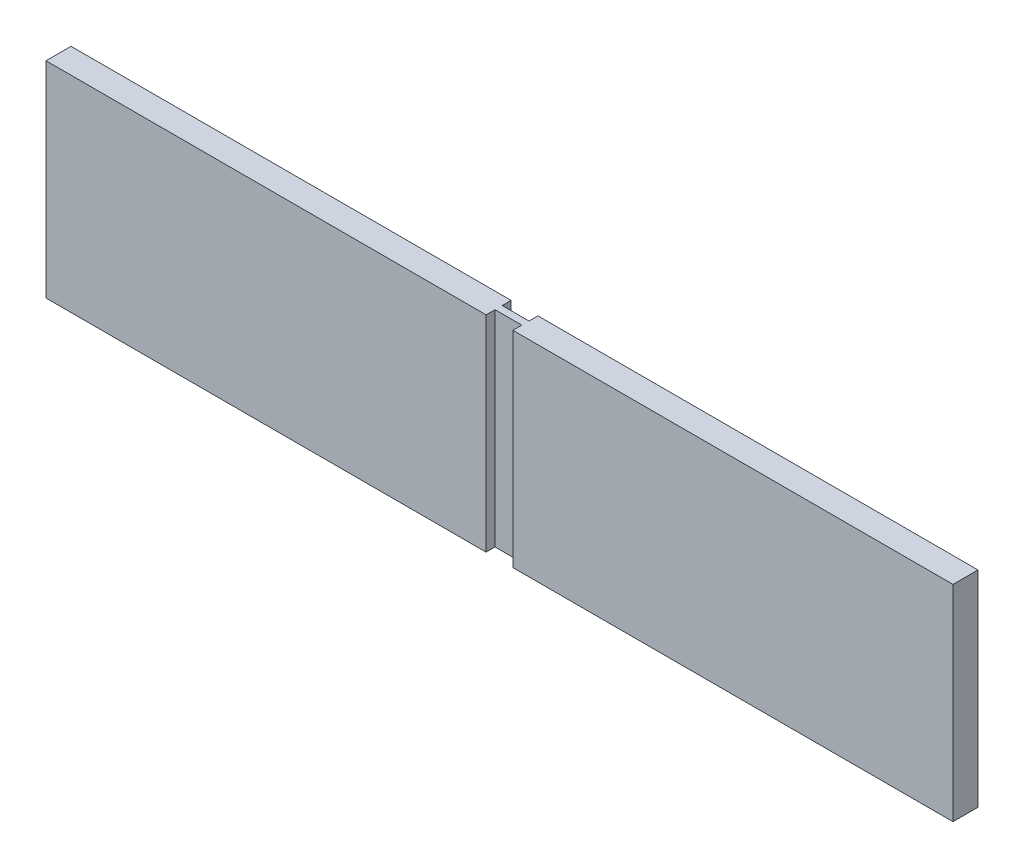
ISO-10303-21;
HEADER;
FILE_DESCRIPTION(('STEP AP214'),'2;1');
FILE_NAME('part.step','',(''),(''),'','','');
FILE_SCHEMA(('AUTOMOTIVE_DESIGN { 1 0 10303 214 1 1 1 1 }'));
ENDSEC;
DATA;
#1=APPLICATION_CONTEXT('core data for automotive mechanical design processes');
#2=APPLICATION_PROTOCOL_DEFINITION('international standard','automotive_design',2000,#1);
#3=PRODUCT_CONTEXT('',#1,'mechanical');
#4=PRODUCT('Part','Part','',(#3));
#5=PRODUCT_RELATED_PRODUCT_CATEGORY('part','',(#4));
#6=PRODUCT_DEFINITION_FORMATION('','',#4);
#7=PRODUCT_DEFINITION_CONTEXT('part definition',#1,'design');
#8=PRODUCT_DEFINITION('design','',#6,#7);
#9=PRODUCT_DEFINITION_SHAPE('','',#8);
#10=(LENGTH_UNIT() NAMED_UNIT(*) SI_UNIT(.MILLI.,.METRE.));
#11=(NAMED_UNIT(*) PLANE_ANGLE_UNIT() SI_UNIT($,.RADIAN.));
#12=(NAMED_UNIT(*) SI_UNIT($,.STERADIAN.) SOLID_ANGLE_UNIT());
#13=UNCERTAINTY_MEASURE_WITH_UNIT(LENGTH_MEASURE(1.E-05),#10,'distance_accuracy_value','');
#14=(GEOMETRIC_REPRESENTATION_CONTEXT(3) GLOBAL_UNCERTAINTY_ASSIGNED_CONTEXT((#13)) GLOBAL_UNIT_ASSIGNED_CONTEXT((#10,
#11,#12)) REPRESENTATION_CONTEXT('',''));
#15=CARTESIAN_POINT('',(0.,0.,0.));
#16=DIRECTION('',(0.,0.,1.));
#17=DIRECTION('',(1.,0.,0.));
#18=AXIS2_PLACEMENT_3D('',#15,#16,#17);
#19=CARTESIAN_POINT('',(0.,0.,2.8));
#20=DIRECTION('',(0.,0.,-1.));
#21=DIRECTION('',(-1.,0.,0.));
#22=AXIS2_PLACEMENT_3D('',#19,#20,#21);
#23=PLANE('',#22);
#24=DIRECTION('',(1.,0.,0.));
#25=VECTOR('',#24,1.);
#26=CARTESIAN_POINT('',(0.,0.,2.8));
#27=LINE('',#26,#25);
#28=CARTESIAN_POINT('',(0.,0.,2.8));
#29=VERTEX_POINT('',#28);
#30=CARTESIAN_POINT('',(49.25,0.,2.8));
#31=VERTEX_POINT('',#30);
#32=EDGE_CURVE('E137',#29,#31,#27,.T.);
#33=ORIENTED_EDGE('',*,*,#32,.T.);
#34=DIRECTION('',(0.,1.,0.));
#35=VECTOR('',#34,1.);
#36=CARTESIAN_POINT('',(49.25,0.,2.8));
#37=LINE('',#36,#35);
#38=CARTESIAN_POINT('',(49.25,23.,2.8));
#39=VERTEX_POINT('',#38);
#40=EDGE_CURVE('E11',#31,#39,#37,.T.);
#41=ORIENTED_EDGE('',*,*,#40,.T.);
#42=DIRECTION('',(-1.,0.,0.));
#43=VECTOR('',#42,1.);
#44=CARTESIAN_POINT('',(0.,23.,2.8));
#45=LINE('',#44,#43);
#46=CARTESIAN_POINT('',(0.,23.,2.8));
#47=VERTEX_POINT('',#46);
#48=EDGE_CURVE('E135',#39,#47,#45,.T.);
#49=ORIENTED_EDGE('',*,*,#48,.T.);
#50=DIRECTION('',(0.,-1.,0.));
#51=VECTOR('',#50,1.);
#52=CARTESIAN_POINT('',(0.,0.,2.8));
#53=LINE('',#52,#51);
#54=EDGE_CURVE('E163',#47,#29,#53,.T.);
#55=ORIENTED_EDGE('',*,*,#54,.T.);
#56=EDGE_LOOP('',(#33,#41,#49,#55));
#57=FACE_BOUND('',#56,.T.);
#58=ADVANCED_FACE('F32',(#57),#23,.F.);
#59=CARTESIAN_POINT('',(0.,0.,0.));
#60=DIRECTION('',(0.,0.,-1.));
#61=DIRECTION('',(-1.,0.,0.));
#62=AXIS2_PLACEMENT_3D('',#59,#60,#61);
#63=PLANE('',#62);
#64=DIRECTION('',(0.,1.,0.));
#65=VECTOR('',#64,1.);
#66=CARTESIAN_POINT('',(49.25,0.,0.));
#67=LINE('',#66,#65);
#68=CARTESIAN_POINT('',(49.25,0.,0.));
#69=VERTEX_POINT('',#68);
#70=CARTESIAN_POINT('',(49.25,23.,0.));
#71=VERTEX_POINT('',#70);
#72=EDGE_CURVE('E176',#69,#71,#67,.T.);
#73=ORIENTED_EDGE('',*,*,#72,.F.);
#74=DIRECTION('',(1.,0.,0.));
#75=VECTOR('',#74,1.);
#76=CARTESIAN_POINT('',(0.,0.,0.));
#77=LINE('',#76,#75);
#78=CARTESIAN_POINT('',(0.,0.,0.));
#79=VERTEX_POINT('',#78);
#80=EDGE_CURVE('E154',#79,#69,#77,.T.);
#81=ORIENTED_EDGE('',*,*,#80,.F.);
#82=DIRECTION('',(0.,-1.,0.));
#83=VECTOR('',#82,1.);
#84=CARTESIAN_POINT('',(0.,0.,0.));
#85=LINE('',#84,#83);
#86=CARTESIAN_POINT('',(0.,23.,0.));
#87=VERTEX_POINT('',#86);
#88=EDGE_CURVE('E149',#87,#79,#85,.T.);
#89=ORIENTED_EDGE('',*,*,#88,.F.);
#90=DIRECTION('',(-1.,0.,0.));
#91=VECTOR('',#90,1.);
#92=CARTESIAN_POINT('',(0.,23.,0.));
#93=LINE('',#92,#91);
#94=EDGE_CURVE('E159',#71,#87,#93,.T.);
#95=ORIENTED_EDGE('',*,*,#94,.F.);
#96=EDGE_LOOP('',(#73,#81,#89,#95));
#97=FACE_BOUND('',#96,.T.);
#98=ADVANCED_FACE('F229',(#97),#63,.T.);
#99=CARTESIAN_POINT('',(0.,0.,2.8));
#100=DIRECTION('',(1.,0.,0.));
#101=DIRECTION('',(0.,0.,-1.));
#102=AXIS2_PLACEMENT_3D('',#99,#100,#101);
#103=PLANE('',#102);
#104=ORIENTED_EDGE('',*,*,#88,.T.);
#105=DIRECTION('',(0.,0.,-1.));
#106=VECTOR('',#105,1.);
#107=CARTESIAN_POINT('',(0.,0.,2.8));
#108=LINE('',#107,#106);
#109=EDGE_CURVE('E171',#29,#79,#108,.T.);
#110=ORIENTED_EDGE('',*,*,#109,.F.);
#111=ORIENTED_EDGE('',*,*,#54,.F.);
#112=DIRECTION('',(0.,0.,-1.));
#113=VECTOR('',#112,1.);
#114=CARTESIAN_POINT('',(0.,23.,2.8));
#115=LINE('',#114,#113);
#116=EDGE_CURVE('E140',#47,#87,#115,.T.);
#117=ORIENTED_EDGE('',*,*,#116,.T.);
#118=EDGE_LOOP('',(#104,#110,#111,#117));
#119=FACE_BOUND('',#118,.T.);
#120=ADVANCED_FACE('F34',(#119),#103,.F.);
#121=CARTESIAN_POINT('',(0.,0.,2.8));
#122=DIRECTION('',(0.,1.,0.));
#123=DIRECTION('',(0.,0.,1.));
#124=AXIS2_PLACEMENT_3D('',#121,#122,#123);
#125=PLANE('',#124);
#126=DIRECTION('',(-1.,0.,0.));
#127=VECTOR('',#126,1.);
#128=CARTESIAN_POINT('',(0.,0.,1.8));
#129=LINE('',#128,#127);
#130=CARTESIAN_POINT('',(52.25,0.,1.8));
#131=VERTEX_POINT('',#130);
#132=CARTESIAN_POINT('',(49.25,0.,1.8));
#133=VERTEX_POINT('',#132);
#134=EDGE_CURVE('E210',#131,#133,#129,.T.);
#135=ORIENTED_EDGE('',*,*,#134,.T.);
#136=DIRECTION('',(0.,0.,1.));
#137=VECTOR('',#136,1.);
#138=CARTESIAN_POINT('',(49.25,0.,2.8));
#139=LINE('',#138,#137);
#140=EDGE_CURVE('E212',#133,#31,#139,.T.);
#141=ORIENTED_EDGE('',*,*,#140,.T.);
#142=ORIENTED_EDGE('',*,*,#32,.F.);
#143=ORIENTED_EDGE('',*,*,#109,.T.);
#144=ORIENTED_EDGE('',*,*,#80,.T.);
#145=DIRECTION('',(0.,0.,1.));
#146=VECTOR('',#145,1.);
#147=CARTESIAN_POINT('',(49.25,0.,2.8));
#148=LINE('',#147,#146);
#149=CARTESIAN_POINT('',(49.25,0.,1.));
#150=VERTEX_POINT('',#149);
#151=EDGE_CURVE('E193',#69,#150,#148,.T.);
#152=ORIENTED_EDGE('',*,*,#151,.T.);
#153=DIRECTION('',(1.,0.,0.));
#154=VECTOR('',#153,1.);
#155=CARTESIAN_POINT('',(0.,0.,1.));
#156=LINE('',#155,#154);
#157=CARTESIAN_POINT('',(52.25,0.,1.));
#158=VERTEX_POINT('',#157);
#159=EDGE_CURVE('E153',#150,#158,#156,.T.);
#160=ORIENTED_EDGE('',*,*,#159,.T.);
#161=DIRECTION('',(0.,0.,-1.));
#162=VECTOR('',#161,1.);
#163=CARTESIAN_POINT('',(52.25,0.,2.8));
#164=LINE('',#163,#162);
#165=CARTESIAN_POINT('',(52.25,0.,0.));
#166=VERTEX_POINT('',#165);
#167=EDGE_CURVE('E196',#158,#166,#164,.T.);
#168=ORIENTED_EDGE('',*,*,#167,.T.);
#169=CARTESIAN_POINT('',(101.5,0.,0.));
#170=VERTEX_POINT('',#169);
#171=EDGE_CURVE('E152',#166,#170,#77,.T.);
#172=ORIENTED_EDGE('',*,*,#171,.T.);
#173=DIRECTION('',(0.,0.,-1.));
#174=VECTOR('',#173,1.);
#175=CARTESIAN_POINT('',(101.5,0.,2.8));
#176=LINE('',#175,#174);
#177=CARTESIAN_POINT('',(101.5,0.,2.8));
#178=VERTEX_POINT('',#177);
#179=EDGE_CURVE('E168',#178,#170,#176,.T.);
#180=ORIENTED_EDGE('',*,*,#179,.F.);
#181=CARTESIAN_POINT('',(52.25,0.,2.8));
#182=VERTEX_POINT('',#181);
#183=EDGE_CURVE('E180',#182,#178,#27,.T.);
#184=ORIENTED_EDGE('',*,*,#183,.F.);
#185=DIRECTION('',(0.,0.,-1.));
#186=VECTOR('',#185,1.);
#187=CARTESIAN_POINT('',(52.25,0.,2.8));
#188=LINE('',#187,#186);
#189=EDGE_CURVE('E47',#182,#131,#188,.T.);
#190=ORIENTED_EDGE('',*,*,#189,.T.);
#191=EDGE_LOOP('',(#135,#141,#142,#143,#144,#152,#160,#168,#172,#180,#184,#190));
#192=FACE_BOUND('',#191,.T.);
#193=ADVANCED_FACE('F187',(#192),#125,.F.);
#194=CARTESIAN_POINT('',(101.5,0.,2.8));
#195=DIRECTION('',(-1.,0.,0.));
#196=DIRECTION('',(0.,0.,1.));
#197=AXIS2_PLACEMENT_3D('',#194,#195,#196);
#198=PLANE('',#197);
#199=DIRECTION('',(0.,1.,0.));
#200=VECTOR('',#199,1.);
#201=CARTESIAN_POINT('',(101.5,0.,0.));
#202=LINE('',#201,#200);
#203=CARTESIAN_POINT('',(101.5,23.,0.));
#204=VERTEX_POINT('',#203);
#205=EDGE_CURVE('E157',#170,#204,#202,.T.);
#206=ORIENTED_EDGE('',*,*,#205,.T.);
#207=DIRECTION('',(0.,0.,-1.));
#208=VECTOR('',#207,1.);
#209=CARTESIAN_POINT('',(101.5,23.,2.8));
#210=LINE('',#209,#208);
#211=CARTESIAN_POINT('',(101.5,23.,2.8));
#212=VERTEX_POINT('',#211);
#213=EDGE_CURVE('E165',#212,#204,#210,.T.);
#214=ORIENTED_EDGE('',*,*,#213,.F.);
#215=DIRECTION('',(0.,1.,0.));
#216=VECTOR('',#215,1.);
#217=CARTESIAN_POINT('',(101.5,0.,2.8));
#218=LINE('',#217,#216);
#219=EDGE_CURVE('E143',#178,#212,#218,.T.);
#220=ORIENTED_EDGE('',*,*,#219,.F.);
#221=ORIENTED_EDGE('',*,*,#179,.T.);
#222=EDGE_LOOP('',(#206,#214,#220,#221));
#223=FACE_BOUND('',#222,.T.);
#224=ADVANCED_FACE('F246',(#223),#198,.F.);
#225=CARTESIAN_POINT('',(0.,23.,2.8));
#226=DIRECTION('',(0.,-1.,0.));
#227=DIRECTION('',(0.,0.,-1.));
#228=AXIS2_PLACEMENT_3D('',#225,#226,#227);
#229=PLANE('',#228);
#230=ORIENTED_EDGE('',*,*,#48,.F.);
#231=DIRECTION('',(0.,0.,1.));
#232=VECTOR('',#231,1.);
#233=CARTESIAN_POINT('',(49.25,23.,2.8));
#234=LINE('',#233,#232);
#235=CARTESIAN_POINT('',(49.25,23.,1.8));
#236=VERTEX_POINT('',#235);
#237=EDGE_CURVE('E121',#236,#39,#234,.T.);
#238=ORIENTED_EDGE('',*,*,#237,.F.);
#239=DIRECTION('',(-1.,0.,0.));
#240=VECTOR('',#239,1.);
#241=CARTESIAN_POINT('',(49.25,23.,1.8));
#242=LINE('',#241,#240);
#243=CARTESIAN_POINT('',(52.25,23.,1.8));
#244=VERTEX_POINT('',#243);
#245=EDGE_CURVE('E217',#244,#236,#242,.T.);
#246=ORIENTED_EDGE('',*,*,#245,.F.);
#247=DIRECTION('',(0.,0.,-1.));
#248=VECTOR('',#247,1.);
#249=CARTESIAN_POINT('',(52.25,23.,2.8));
#250=LINE('',#249,#248);
#251=CARTESIAN_POINT('',(52.25,23.,2.8));
#252=VERTEX_POINT('',#251);
#253=EDGE_CURVE('E130',#252,#244,#250,.T.);
#254=ORIENTED_EDGE('',*,*,#253,.F.);
#255=EDGE_CURVE('E142',#212,#252,#45,.T.);
#256=ORIENTED_EDGE('',*,*,#255,.F.);
#257=ORIENTED_EDGE('',*,*,#213,.T.);
#258=CARTESIAN_POINT('',(52.25,23.,0.));
#259=VERTEX_POINT('',#258);
#260=EDGE_CURVE('E160',#204,#259,#93,.T.);
#261=ORIENTED_EDGE('',*,*,#260,.T.);
#262=DIRECTION('',(0.,0.,-1.));
#263=VECTOR('',#262,1.);
#264=CARTESIAN_POINT('',(52.25,23.,0.));
#265=LINE('',#264,#263);
#266=CARTESIAN_POINT('',(52.25,23.,1.));
#267=VERTEX_POINT('',#266);
#268=EDGE_CURVE('E55',#267,#259,#265,.T.);
#269=ORIENTED_EDGE('',*,*,#268,.F.);
#270=DIRECTION('',(1.,0.,0.));
#271=VECTOR('',#270,1.);
#272=CARTESIAN_POINT('',(49.25,23.,1.));
#273=LINE('',#272,#271);
#274=CARTESIAN_POINT('',(49.25,23.,1.));
#275=VERTEX_POINT('',#274);
#276=EDGE_CURVE('E204',#275,#267,#273,.T.);
#277=ORIENTED_EDGE('',*,*,#276,.F.);
#278=DIRECTION('',(0.,0.,1.));
#279=VECTOR('',#278,1.);
#280=CARTESIAN_POINT('',(49.25,23.,0.));
#281=LINE('',#280,#279);
#282=EDGE_CURVE('E207',#71,#275,#281,.T.);
#283=ORIENTED_EDGE('',*,*,#282,.F.);
#284=ORIENTED_EDGE('',*,*,#94,.T.);
#285=ORIENTED_EDGE('',*,*,#116,.F.);
#286=EDGE_LOOP('',(#230,#238,#246,#254,#256,#257,#261,#269,#277,#283,#284,#285));
#287=FACE_BOUND('',#286,.T.);
#288=ADVANCED_FACE('F138',(#287),#229,.F.);
#289=ORIENTED_EDGE('',*,*,#255,.T.);
#290=DIRECTION('',(0.,-1.,0.));
#291=VECTOR('',#290,1.);
#292=CARTESIAN_POINT('',(52.25,0.,2.8));
#293=LINE('',#292,#291);
#294=EDGE_CURVE('E40',#252,#182,#293,.T.);
#295=ORIENTED_EDGE('',*,*,#294,.T.);
#296=ORIENTED_EDGE('',*,*,#183,.T.);
#297=ORIENTED_EDGE('',*,*,#219,.T.);
#298=EDGE_LOOP('',(#289,#295,#296,#297));
#299=FACE_BOUND('',#298,.T.);
#300=ADVANCED_FACE('F179',(#299),#23,.F.);
#301=DIRECTION('',(0.,-1.,0.));
#302=VECTOR('',#301,1.);
#303=CARTESIAN_POINT('',(52.25,0.,0.));
#304=LINE('',#303,#302);
#305=EDGE_CURVE('E174',#259,#166,#304,.T.);
#306=ORIENTED_EDGE('',*,*,#305,.F.);
#307=ORIENTED_EDGE('',*,*,#260,.F.);
#308=ORIENTED_EDGE('',*,*,#205,.F.);
#309=ORIENTED_EDGE('',*,*,#171,.F.);
#310=EDGE_LOOP('',(#306,#307,#308,#309));
#311=FACE_BOUND('',#310,.T.);
#312=ADVANCED_FACE('F242',(#311),#63,.T.);
#313=CARTESIAN_POINT('',(49.25,-10.,1.));
#314=DIRECTION('',(0.,0.,1.));
#315=DIRECTION('',(1.,0.,0.));
#316=AXIS2_PLACEMENT_3D('',#313,#314,#315);
#317=PLANE('',#316);
#318=DIRECTION('',(0.,1.,0.));
#319=VECTOR('',#318,1.);
#320=CARTESIAN_POINT('',(49.25,-10.,1.));
#321=LINE('',#320,#319);
#322=EDGE_CURVE('E200',#150,#275,#321,.T.);
#323=ORIENTED_EDGE('',*,*,#322,.T.);
#324=ORIENTED_EDGE('',*,*,#276,.T.);
#325=DIRECTION('',(0.,1.,0.));
#326=VECTOR('',#325,1.);
#327=CARTESIAN_POINT('',(52.25,-10.,1.));
#328=LINE('',#327,#326);
#329=EDGE_CURVE('E199',#158,#267,#328,.T.);
#330=ORIENTED_EDGE('',*,*,#329,.F.);
#331=ORIENTED_EDGE('',*,*,#159,.F.);
#332=EDGE_LOOP('',(#323,#324,#330,#331));
#333=FACE_BOUND('',#332,.T.);
#334=ADVANCED_FACE('F236',(#333),#317,.F.);
#335=CARTESIAN_POINT('',(49.25,-10.,0.));
#336=DIRECTION('',(-1.,0.,0.));
#337=DIRECTION('',(0.,0.,1.));
#338=AXIS2_PLACEMENT_3D('',#335,#336,#337);
#339=PLANE('',#338);
#340=ORIENTED_EDGE('',*,*,#72,.T.);
#341=ORIENTED_EDGE('',*,*,#282,.T.);
#342=ORIENTED_EDGE('',*,*,#322,.F.);
#343=ORIENTED_EDGE('',*,*,#151,.F.);
#344=EDGE_LOOP('',(#340,#341,#342,#343));
#345=FACE_BOUND('',#344,.T.);
#346=ADVANCED_FACE('F232',(#345),#339,.F.);
#347=CARTESIAN_POINT('',(52.25,-10.,0.));
#348=DIRECTION('',(1.,0.,0.));
#349=DIRECTION('',(0.,0.,-1.));
#350=AXIS2_PLACEMENT_3D('',#347,#348,#349);
#351=PLANE('',#350);
#352=ORIENTED_EDGE('',*,*,#329,.T.);
#353=ORIENTED_EDGE('',*,*,#268,.T.);
#354=ORIENTED_EDGE('',*,*,#305,.T.);
#355=ORIENTED_EDGE('',*,*,#167,.F.);
#356=EDGE_LOOP('',(#352,#353,#354,#355));
#357=FACE_BOUND('',#356,.T.);
#358=ADVANCED_FACE('F238',(#357),#351,.F.);
#359=CARTESIAN_POINT('',(49.25,-10.,1.8));
#360=DIRECTION('',(0.,0.,-1.));
#361=DIRECTION('',(-1.,0.,0.));
#362=AXIS2_PLACEMENT_3D('',#359,#360,#361);
#363=PLANE('',#362);
#364=DIRECTION('',(0.,1.,0.));
#365=VECTOR('',#364,1.);
#366=CARTESIAN_POINT('',(52.25,-10.,1.8));
#367=LINE('',#366,#365);
#368=EDGE_CURVE('E215',#131,#244,#367,.T.);
#369=ORIENTED_EDGE('',*,*,#368,.T.);
#370=ORIENTED_EDGE('',*,*,#245,.T.);
#371=DIRECTION('',(0.,1.,0.));
#372=VECTOR('',#371,1.);
#373=CARTESIAN_POINT('',(49.25,-10.,1.8));
#374=LINE('',#373,#372);
#375=EDGE_CURVE('E125',#133,#236,#374,.T.);
#376=ORIENTED_EDGE('',*,*,#375,.F.);
#377=ORIENTED_EDGE('',*,*,#134,.F.);
#378=EDGE_LOOP('',(#369,#370,#376,#377));
#379=FACE_BOUND('',#378,.T.);
#380=ADVANCED_FACE('F222',(#379),#363,.F.);
#381=CARTESIAN_POINT('',(49.25,-10.,2.8));
#382=DIRECTION('',(-1.,0.,0.));
#383=DIRECTION('',(0.,0.,1.));
#384=AXIS2_PLACEMENT_3D('',#381,#382,#383);
#385=PLANE('',#384);
#386=ORIENTED_EDGE('',*,*,#375,.T.);
#387=ORIENTED_EDGE('',*,*,#237,.T.);
#388=ORIENTED_EDGE('',*,*,#40,.F.);
#389=ORIENTED_EDGE('',*,*,#140,.F.);
#390=EDGE_LOOP('',(#386,#387,#388,#389));
#391=FACE_BOUND('',#390,.T.);
#392=ADVANCED_FACE('F122',(#391),#385,.F.);
#393=CARTESIAN_POINT('',(52.25,-10.,2.8));
#394=DIRECTION('',(1.,0.,0.));
#395=DIRECTION('',(0.,0.,-1.));
#396=AXIS2_PLACEMENT_3D('',#393,#394,#395);
#397=PLANE('',#396);
#398=ORIENTED_EDGE('',*,*,#294,.F.);
#399=ORIENTED_EDGE('',*,*,#253,.T.);
#400=ORIENTED_EDGE('',*,*,#368,.F.);
#401=ORIENTED_EDGE('',*,*,#189,.F.);
#402=EDGE_LOOP('',(#398,#399,#400,#401));
#403=FACE_BOUND('',#402,.T.);
#404=ADVANCED_FACE('F220',(#403),#397,.F.);
#405=CLOSED_SHELL('',(#58,#98,#120,#193,#224,#288,#300,#312,#334,#346,#358,#380,#392,#404));
#406=MANIFOLD_SOLID_BREP('B2',#405);
#407=ADVANCED_BREP_SHAPE_REPRESENTATION('',(#18,#406),#14);
#408=SHAPE_DEFINITION_REPRESENTATION(#9,#407);
ENDSEC;
END-ISO-10303-21;
